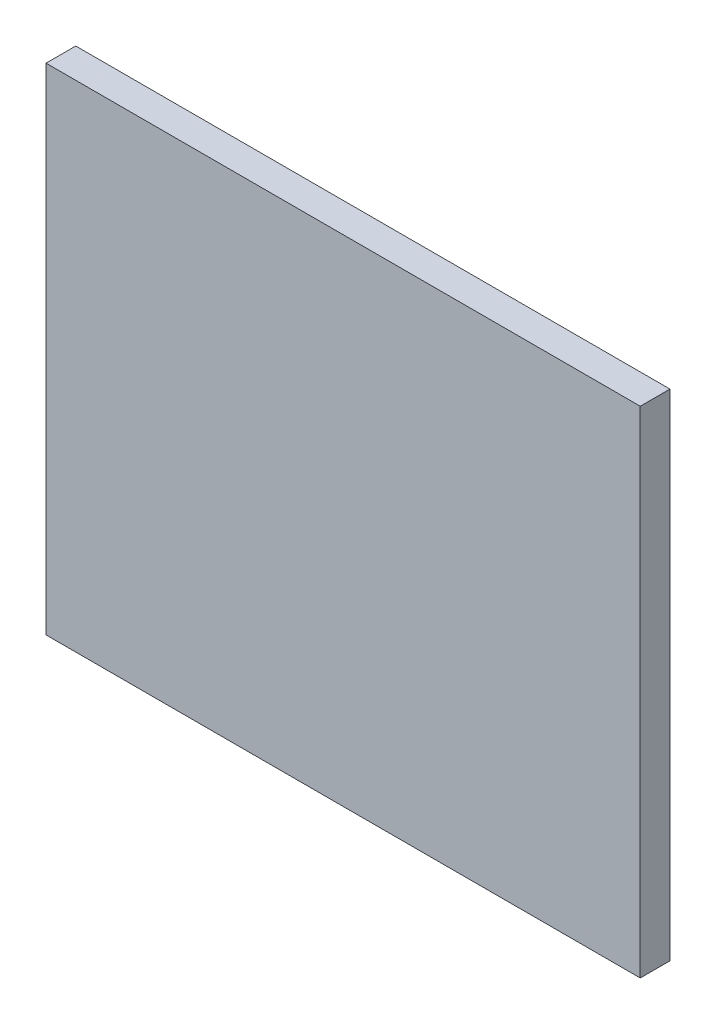
ISO-10303-21;
HEADER;
FILE_DESCRIPTION(('STEP AP214'),'2;1');
FILE_NAME('part.step','',(''),(''),'','','');
FILE_SCHEMA(('AUTOMOTIVE_DESIGN { 1 0 10303 214 1 1 1 1 }'));
ENDSEC;
DATA;
#1=APPLICATION_CONTEXT('core data for automotive mechanical design processes');
#2=APPLICATION_PROTOCOL_DEFINITION('international standard','automotive_design',2000,#1);
#3=PRODUCT_CONTEXT('',#1,'mechanical');
#4=PRODUCT('Part','Part','',(#3));
#5=PRODUCT_RELATED_PRODUCT_CATEGORY('part','',(#4));
#6=PRODUCT_DEFINITION_FORMATION('','',#4);
#7=PRODUCT_DEFINITION_CONTEXT('part definition',#1,'design');
#8=PRODUCT_DEFINITION('design','',#6,#7);
#9=PRODUCT_DEFINITION_SHAPE('','',#8);
#10=(LENGTH_UNIT() NAMED_UNIT(*) SI_UNIT(.MILLI.,.METRE.));
#11=(NAMED_UNIT(*) PLANE_ANGLE_UNIT() SI_UNIT($,.RADIAN.));
#12=(NAMED_UNIT(*) SI_UNIT($,.STERADIAN.) SOLID_ANGLE_UNIT());
#13=UNCERTAINTY_MEASURE_WITH_UNIT(LENGTH_MEASURE(1.E-05),#10,'distance_accuracy_value','');
#14=(GEOMETRIC_REPRESENTATION_CONTEXT(3) GLOBAL_UNCERTAINTY_ASSIGNED_CONTEXT((#13)) GLOBAL_UNIT_ASSIGNED_CONTEXT((#10,
#11,#12)) REPRESENTATION_CONTEXT('',''));
#15=CARTESIAN_POINT('',(0.,0.,0.));
#16=DIRECTION('',(0.,0.,1.));
#17=DIRECTION('',(1.,0.,0.));
#18=AXIS2_PLACEMENT_3D('',#15,#16,#17);
#19=CARTESIAN_POINT('',(-30.,50.,1.5));
#20=DIRECTION('',(1.,0.,0.));
#21=DIRECTION('',(0.,0.,-1.));
#22=AXIS2_PLACEMENT_3D('',#19,#20,#21);
#23=PLANE('',#22);
#24=DIRECTION('',(0.,0.,1.));
#25=VECTOR('',#24,1.);
#26=CARTESIAN_POINT('',(-30.,0.,1.5));
#27=LINE('',#26,#25);
#28=CARTESIAN_POINT('',(-30.,0.,-1.49999999999999));
#29=VERTEX_POINT('',#28);
#30=CARTESIAN_POINT('',(-30.,0.,1.5));
#31=VERTEX_POINT('',#30);
#32=EDGE_CURVE('E96',#29,#31,#27,.T.);
#33=ORIENTED_EDGE('',*,*,#32,.T.);
#34=DIRECTION('',(0.,-1.,0.));
#35=VECTOR('',#34,1.);
#36=CARTESIAN_POINT('',(-30.,50.,1.5));
#37=LINE('',#36,#35);
#38=CARTESIAN_POINT('',(-30.,50.,1.5));
#39=VERTEX_POINT('',#38);
#40=EDGE_CURVE('E11',#39,#31,#37,.T.);
#41=ORIENTED_EDGE('',*,*,#40,.F.);
#42=DIRECTION('',(0.,0.,1.));
#43=VECTOR('',#42,1.);
#44=CARTESIAN_POINT('',(-30.,50.,1.5));
#45=LINE('',#44,#43);
#46=CARTESIAN_POINT('',(-30.,50.,-1.49999999999999));
#47=VERTEX_POINT('',#46);
#48=EDGE_CURVE('E84',#47,#39,#45,.T.);
#49=ORIENTED_EDGE('',*,*,#48,.F.);
#50=DIRECTION('',(0.,-1.,0.));
#51=VECTOR('',#50,1.);
#52=CARTESIAN_POINT('',(-30.,50.,-1.49999999999999));
#53=LINE('',#52,#51);
#54=EDGE_CURVE('E92',#47,#29,#53,.T.);
#55=ORIENTED_EDGE('',*,*,#54,.T.);
#56=EDGE_LOOP('',(#33,#41,#49,#55));
#57=FACE_BOUND('',#56,.T.);
#58=ADVANCED_FACE('F33',(#57),#23,.F.);
#59=CARTESIAN_POINT('',(30.,50.,1.5));
#60=DIRECTION('',(0.,0.,-1.));
#61=DIRECTION('',(-1.,0.,0.));
#62=AXIS2_PLACEMENT_3D('',#59,#60,#61);
#63=PLANE('',#62);
#64=DIRECTION('',(1.,0.,0.));
#65=VECTOR('',#64,1.);
#66=CARTESIAN_POINT('',(30.,0.,1.5));
#67=LINE('',#66,#65);
#68=CARTESIAN_POINT('',(30.,0.,1.5));
#69=VERTEX_POINT('',#68);
#70=EDGE_CURVE('E88',#31,#69,#67,.T.);
#71=ORIENTED_EDGE('',*,*,#70,.T.);
#72=DIRECTION('',(0.,-1.,0.));
#73=VECTOR('',#72,1.);
#74=CARTESIAN_POINT('',(30.,50.,1.5));
#75=LINE('',#74,#73);
#76=CARTESIAN_POINT('',(30.,50.,1.5));
#77=VERTEX_POINT('',#76);
#78=EDGE_CURVE('E41',#77,#69,#75,.T.);
#79=ORIENTED_EDGE('',*,*,#78,.F.);
#80=DIRECTION('',(1.,0.,0.));
#81=VECTOR('',#80,1.);
#82=CARTESIAN_POINT('',(30.,50.,1.5));
#83=LINE('',#82,#81);
#84=EDGE_CURVE('E79',#39,#77,#83,.T.);
#85=ORIENTED_EDGE('',*,*,#84,.F.);
#86=ORIENTED_EDGE('',*,*,#40,.T.);
#87=EDGE_LOOP('',(#71,#79,#85,#86));
#88=FACE_BOUND('',#87,.T.);
#89=ADVANCED_FACE('F87',(#88),#63,.F.);
#90=CARTESIAN_POINT('',(30.,50.,1.5));
#91=DIRECTION('',(-1.,0.,0.));
#92=DIRECTION('',(0.,0.,1.));
#93=AXIS2_PLACEMENT_3D('',#90,#91,#92);
#94=PLANE('',#93);
#95=DIRECTION('',(0.,0.,-1.));
#96=VECTOR('',#95,1.);
#97=CARTESIAN_POINT('',(30.,0.,1.5));
#98=LINE('',#97,#96);
#99=CARTESIAN_POINT('',(30.,0.,-1.5));
#100=VERTEX_POINT('',#99);
#101=EDGE_CURVE('E66',#69,#100,#98,.T.);
#102=ORIENTED_EDGE('',*,*,#101,.T.);
#103=DIRECTION('',(0.,-1.,0.));
#104=VECTOR('',#103,1.);
#105=CARTESIAN_POINT('',(30.,50.,-1.5));
#106=LINE('',#105,#104);
#107=CARTESIAN_POINT('',(30.,50.,-1.5));
#108=VERTEX_POINT('',#107);
#109=EDGE_CURVE('E89',#108,#100,#106,.T.);
#110=ORIENTED_EDGE('',*,*,#109,.F.);
#111=DIRECTION('',(0.,0.,-1.));
#112=VECTOR('',#111,1.);
#113=CARTESIAN_POINT('',(30.,50.,1.5));
#114=LINE('',#113,#112);
#115=EDGE_CURVE('E82',#77,#108,#114,.T.);
#116=ORIENTED_EDGE('',*,*,#115,.F.);
#117=ORIENTED_EDGE('',*,*,#78,.T.);
#118=EDGE_LOOP('',(#102,#110,#116,#117));
#119=FACE_BOUND('',#118,.T.);
#120=ADVANCED_FACE('F90',(#119),#94,.F.);
#121=CARTESIAN_POINT('',(30.,50.,-1.5));
#122=DIRECTION('',(0.,0.,1.));
#123=DIRECTION('',(1.,0.,0.));
#124=AXIS2_PLACEMENT_3D('',#121,#122,#123);
#125=PLANE('',#124);
#126=DIRECTION('',(-1.,0.,0.));
#127=VECTOR('',#126,1.);
#128=CARTESIAN_POINT('',(30.,0.,-1.5));
#129=LINE('',#128,#127);
#130=EDGE_CURVE('E72',#100,#29,#129,.T.);
#131=ORIENTED_EDGE('',*,*,#130,.T.);
#132=ORIENTED_EDGE('',*,*,#54,.F.);
#133=DIRECTION('',(-1.,0.,0.));
#134=VECTOR('',#133,1.);
#135=CARTESIAN_POINT('',(30.,50.,-1.5));
#136=LINE('',#135,#134);
#137=EDGE_CURVE('E49',#108,#47,#136,.T.);
#138=ORIENTED_EDGE('',*,*,#137,.F.);
#139=ORIENTED_EDGE('',*,*,#109,.T.);
#140=EDGE_LOOP('',(#131,#132,#138,#139));
#141=FACE_BOUND('',#140,.T.);
#142=ADVANCED_FACE('F103',(#141),#125,.F.);
#143=CARTESIAN_POINT('',(0.,50.,0.));
#144=DIRECTION('',(0.,1.,0.));
#145=DIRECTION('',(0.,0.,1.));
#146=AXIS2_PLACEMENT_3D('',#143,#144,#145);
#147=PLANE('',#146);
#148=ORIENTED_EDGE('',*,*,#48,.T.);
#149=ORIENTED_EDGE('',*,*,#84,.T.);
#150=ORIENTED_EDGE('',*,*,#115,.T.);
#151=ORIENTED_EDGE('',*,*,#137,.T.);
#152=EDGE_LOOP('',(#148,#149,#150,#151));
#153=FACE_BOUND('',#152,.T.);
#154=ADVANCED_FACE('F80',(#153),#147,.T.);
#155=CARTESIAN_POINT('',(0.,0.,0.));
#156=DIRECTION('',(0.,1.,0.));
#157=DIRECTION('',(0.,0.,1.));
#158=AXIS2_PLACEMENT_3D('',#155,#156,#157);
#159=PLANE('',#158);
#160=ORIENTED_EDGE('',*,*,#32,.F.);
#161=ORIENTED_EDGE('',*,*,#130,.F.);
#162=ORIENTED_EDGE('',*,*,#101,.F.);
#163=ORIENTED_EDGE('',*,*,#70,.F.);
#164=EDGE_LOOP('',(#160,#161,#162,#163));
#165=FACE_BOUND('',#164,.T.);
#166=ADVANCED_FACE('F106',(#165),#159,.F.);
#167=CLOSED_SHELL('',(#58,#89,#120,#142,#154,#166));
#168=MANIFOLD_SOLID_BREP('B2',#167);
#169=ADVANCED_BREP_SHAPE_REPRESENTATION('',(#18,#168),#14);
#170=SHAPE_DEFINITION_REPRESENTATION(#9,#169);
ENDSEC;
END-ISO-10303-21;
